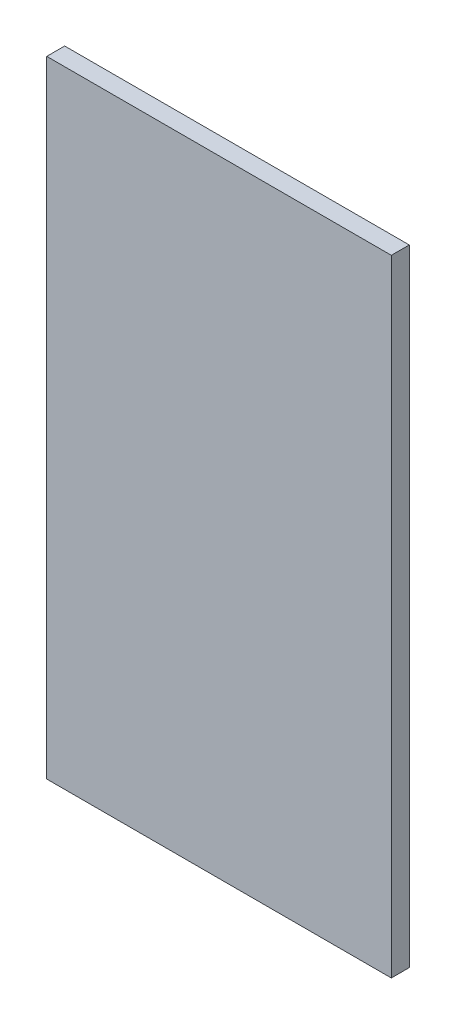
ISO-10303-21;
HEADER;
FILE_DESCRIPTION(('STEP AP214'),'2;1');
FILE_NAME('part.step','',(''),(''),'','','');
FILE_SCHEMA(('AUTOMOTIVE_DESIGN { 1 0 10303 214 1 1 1 1 }'));
ENDSEC;
DATA;
#1=APPLICATION_CONTEXT('core data for automotive mechanical design processes');
#2=APPLICATION_PROTOCOL_DEFINITION('international standard','automotive_design',2000,#1);
#3=PRODUCT_CONTEXT('',#1,'mechanical');
#4=PRODUCT('Part','Part','',(#3));
#5=PRODUCT_RELATED_PRODUCT_CATEGORY('part','',(#4));
#6=PRODUCT_DEFINITION_FORMATION('','',#4);
#7=PRODUCT_DEFINITION_CONTEXT('part definition',#1,'design');
#8=PRODUCT_DEFINITION('design','',#6,#7);
#9=PRODUCT_DEFINITION_SHAPE('','',#8);
#10=(LENGTH_UNIT() NAMED_UNIT(*) SI_UNIT(.MILLI.,.METRE.));
#11=(NAMED_UNIT(*) PLANE_ANGLE_UNIT() SI_UNIT($,.RADIAN.));
#12=(NAMED_UNIT(*) SI_UNIT($,.STERADIAN.) SOLID_ANGLE_UNIT());
#13=UNCERTAINTY_MEASURE_WITH_UNIT(LENGTH_MEASURE(1.E-05),#10,'distance_accuracy_value','');
#14=(GEOMETRIC_REPRESENTATION_CONTEXT(3) GLOBAL_UNCERTAINTY_ASSIGNED_CONTEXT((#13)) GLOBAL_UNIT_ASSIGNED_CONTEXT((#10,
#11,#12)) REPRESENTATION_CONTEXT('',''));
#15=CARTESIAN_POINT('',(0.,0.,0.));
#16=DIRECTION('',(0.,0.,1.));
#17=DIRECTION('',(1.,0.,0.));
#18=AXIS2_PLACEMENT_3D('',#15,#16,#17);
#19=CARTESIAN_POINT('',(-490.,-890.,25.5));
#20=DIRECTION('',(1.,0.,0.));
#21=DIRECTION('',(0.,0.,-1.));
#22=AXIS2_PLACEMENT_3D('',#19,#20,#21);
#23=PLANE('',#22);
#24=DIRECTION('',(0.,-1.,0.));
#25=VECTOR('',#24,1.);
#26=CARTESIAN_POINT('',(-490.,-890.,-25.5));
#27=LINE('',#26,#25);
#28=CARTESIAN_POINT('',(-490.,890.,-25.5));
#29=VERTEX_POINT('',#28);
#30=CARTESIAN_POINT('',(-490.,-890.,-25.5));
#31=VERTEX_POINT('',#30);
#32=EDGE_CURVE('E93',#29,#31,#27,.T.);
#33=ORIENTED_EDGE('',*,*,#32,.T.);
#34=DIRECTION('',(0.,0.,-1.));
#35=VECTOR('',#34,1.);
#36=CARTESIAN_POINT('',(-490.,-890.,25.5));
#37=LINE('',#36,#35);
#38=CARTESIAN_POINT('',(-490.,-890.,25.5));
#39=VERTEX_POINT('',#38);
#40=EDGE_CURVE('E11',#39,#31,#37,.T.);
#41=ORIENTED_EDGE('',*,*,#40,.F.);
#42=DIRECTION('',(0.,-1.,0.));
#43=VECTOR('',#42,1.);
#44=CARTESIAN_POINT('',(-490.,-890.,25.5));
#45=LINE('',#44,#43);
#46=CARTESIAN_POINT('',(-490.,890.,25.5));
#47=VERTEX_POINT('',#46);
#48=EDGE_CURVE('E81',#47,#39,#45,.T.);
#49=ORIENTED_EDGE('',*,*,#48,.F.);
#50=DIRECTION('',(0.,0.,-1.));
#51=VECTOR('',#50,1.);
#52=CARTESIAN_POINT('',(-490.,890.,25.5));
#53=LINE('',#52,#51);
#54=EDGE_CURVE('E89',#47,#29,#53,.T.);
#55=ORIENTED_EDGE('',*,*,#54,.T.);
#56=EDGE_LOOP('',(#33,#41,#49,#55));
#57=FACE_BOUND('',#56,.T.);
#58=ADVANCED_FACE('F30',(#57),#23,.F.);
#59=CARTESIAN_POINT('',(490.,-890.,25.5));
#60=DIRECTION('',(0.,1.,0.));
#61=DIRECTION('',(-1.,0.,0.));
#62=AXIS2_PLACEMENT_3D('',#59,#60,#61);
#63=PLANE('',#62);
#64=DIRECTION('',(1.,0.,0.));
#65=VECTOR('',#64,1.);
#66=CARTESIAN_POINT('',(490.,-890.,-25.5));
#67=LINE('',#66,#65);
#68=CARTESIAN_POINT('',(490.,-890.,-25.5));
#69=VERTEX_POINT('',#68);
#70=EDGE_CURVE('E85',#31,#69,#67,.T.);
#71=ORIENTED_EDGE('',*,*,#70,.T.);
#72=DIRECTION('',(0.,0.,-1.));
#73=VECTOR('',#72,1.);
#74=CARTESIAN_POINT('',(490.,-890.,25.5));
#75=LINE('',#74,#73);
#76=CARTESIAN_POINT('',(490.,-890.,25.5));
#77=VERTEX_POINT('',#76);
#78=EDGE_CURVE('E38',#77,#69,#75,.T.);
#79=ORIENTED_EDGE('',*,*,#78,.F.);
#80=DIRECTION('',(1.,0.,0.));
#81=VECTOR('',#80,1.);
#82=CARTESIAN_POINT('',(490.,-890.,25.5));
#83=LINE('',#82,#81);
#84=EDGE_CURVE('E76',#39,#77,#83,.T.);
#85=ORIENTED_EDGE('',*,*,#84,.F.);
#86=ORIENTED_EDGE('',*,*,#40,.T.);
#87=EDGE_LOOP('',(#71,#79,#85,#86));
#88=FACE_BOUND('',#87,.T.);
#89=ADVANCED_FACE('F84',(#88),#63,.F.);
#90=CARTESIAN_POINT('',(490.,-890.,25.5));
#91=DIRECTION('',(-1.,0.,0.));
#92=DIRECTION('',(0.,0.,1.));
#93=AXIS2_PLACEMENT_3D('',#90,#91,#92);
#94=PLANE('',#93);
#95=DIRECTION('',(0.,1.,0.));
#96=VECTOR('',#95,1.);
#97=CARTESIAN_POINT('',(490.,-890.,-25.5));
#98=LINE('',#97,#96);
#99=CARTESIAN_POINT('',(490.,890.,-25.5));
#100=VERTEX_POINT('',#99);
#101=EDGE_CURVE('E63',#69,#100,#98,.T.);
#102=ORIENTED_EDGE('',*,*,#101,.T.);
#103=DIRECTION('',(0.,0.,-1.));
#104=VECTOR('',#103,1.);
#105=CARTESIAN_POINT('',(490.,890.,25.5));
#106=LINE('',#105,#104);
#107=CARTESIAN_POINT('',(490.,890.,25.5));
#108=VERTEX_POINT('',#107);
#109=EDGE_CURVE('E86',#108,#100,#106,.T.);
#110=ORIENTED_EDGE('',*,*,#109,.F.);
#111=DIRECTION('',(0.,1.,0.));
#112=VECTOR('',#111,1.);
#113=CARTESIAN_POINT('',(490.,-890.,25.5));
#114=LINE('',#113,#112);
#115=EDGE_CURVE('E79',#77,#108,#114,.T.);
#116=ORIENTED_EDGE('',*,*,#115,.F.);
#117=ORIENTED_EDGE('',*,*,#78,.T.);
#118=EDGE_LOOP('',(#102,#110,#116,#117));
#119=FACE_BOUND('',#118,.T.);
#120=ADVANCED_FACE('F87',(#119),#94,.F.);
#121=CARTESIAN_POINT('',(490.,890.,25.5));
#122=DIRECTION('',(0.,-1.,0.));
#123=DIRECTION('',(1.,0.,0.));
#124=AXIS2_PLACEMENT_3D('',#121,#122,#123);
#125=PLANE('',#124);
#126=DIRECTION('',(-1.,0.,0.));
#127=VECTOR('',#126,1.);
#128=CARTESIAN_POINT('',(490.,890.,-25.5));
#129=LINE('',#128,#127);
#130=EDGE_CURVE('E69',#100,#29,#129,.T.);
#131=ORIENTED_EDGE('',*,*,#130,.T.);
#132=ORIENTED_EDGE('',*,*,#54,.F.);
#133=DIRECTION('',(-1.,0.,0.));
#134=VECTOR('',#133,1.);
#135=CARTESIAN_POINT('',(490.,890.,25.5));
#136=LINE('',#135,#134);
#137=EDGE_CURVE('E46',#108,#47,#136,.T.);
#138=ORIENTED_EDGE('',*,*,#137,.F.);
#139=ORIENTED_EDGE('',*,*,#109,.T.);
#140=EDGE_LOOP('',(#131,#132,#138,#139));
#141=FACE_BOUND('',#140,.T.);
#142=ADVANCED_FACE('F100',(#141),#125,.F.);
#143=CARTESIAN_POINT('',(0.,0.,25.5));
#144=DIRECTION('',(0.,0.,1.));
#145=DIRECTION('',(1.,0.,0.));
#146=AXIS2_PLACEMENT_3D('',#143,#144,#145);
#147=PLANE('',#146);
#148=ORIENTED_EDGE('',*,*,#48,.T.);
#149=ORIENTED_EDGE('',*,*,#84,.T.);
#150=ORIENTED_EDGE('',*,*,#115,.T.);
#151=ORIENTED_EDGE('',*,*,#137,.T.);
#152=EDGE_LOOP('',(#148,#149,#150,#151));
#153=FACE_BOUND('',#152,.T.);
#154=ADVANCED_FACE('F77',(#153),#147,.T.);
#155=CARTESIAN_POINT('',(0.,0.,-25.5));
#156=DIRECTION('',(0.,0.,1.));
#157=DIRECTION('',(1.,0.,0.));
#158=AXIS2_PLACEMENT_3D('',#155,#156,#157);
#159=PLANE('',#158);
#160=ORIENTED_EDGE('',*,*,#32,.F.);
#161=ORIENTED_EDGE('',*,*,#130,.F.);
#162=ORIENTED_EDGE('',*,*,#101,.F.);
#163=ORIENTED_EDGE('',*,*,#70,.F.);
#164=EDGE_LOOP('',(#160,#161,#162,#163));
#165=FACE_BOUND('',#164,.T.);
#166=ADVANCED_FACE('F103',(#165),#159,.F.);
#167=CLOSED_SHELL('',(#58,#89,#120,#142,#154,#166));
#168=MANIFOLD_SOLID_BREP('B2',#167);
#169=ADVANCED_BREP_SHAPE_REPRESENTATION('',(#18,#168),#14);
#170=SHAPE_DEFINITION_REPRESENTATION(#9,#169);
ENDSEC;
END-ISO-10303-21;
